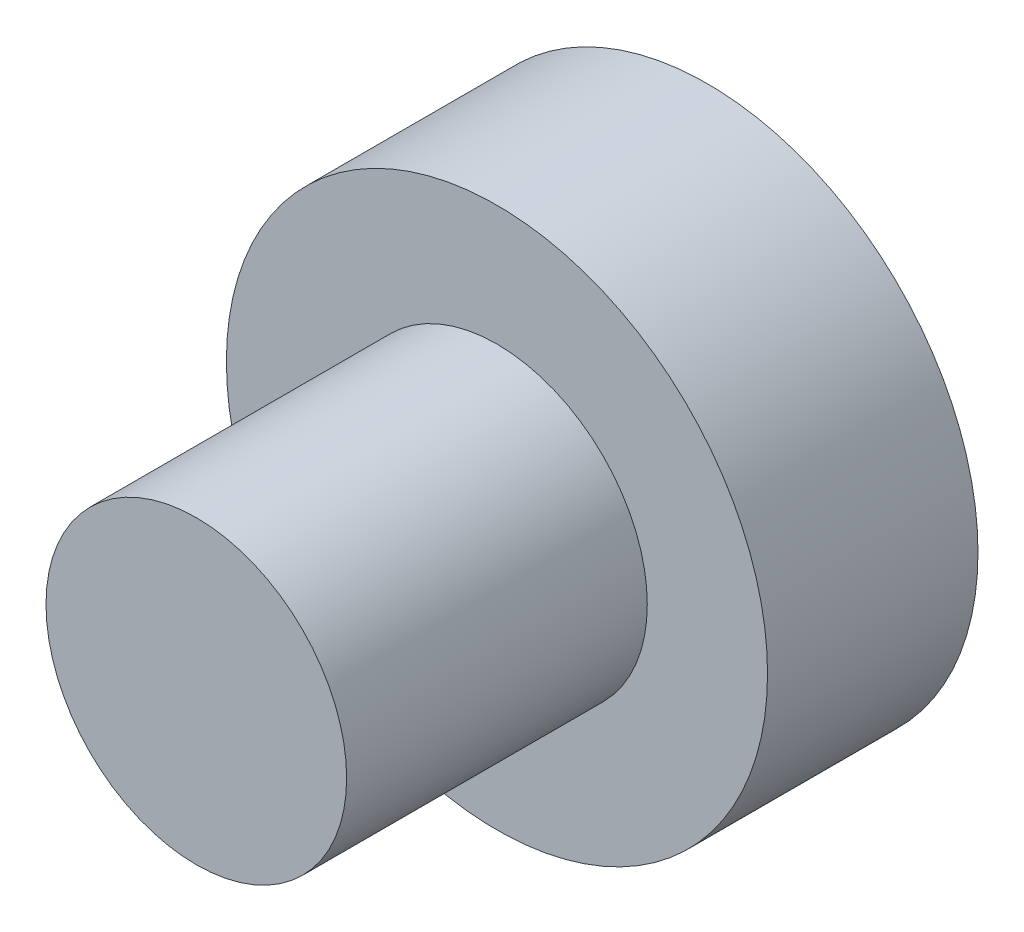
ISO-10303-21;
HEADER;
FILE_DESCRIPTION(('STEP AP214'),'2;1');
FILE_NAME('part.step','',(''),(''),'','','');
FILE_SCHEMA(('AUTOMOTIVE_DESIGN { 1 0 10303 214 1 1 1 1 }'));
ENDSEC;
DATA;
#1=APPLICATION_CONTEXT('core data for automotive mechanical design processes');
#2=APPLICATION_PROTOCOL_DEFINITION('international standard','automotive_design',2000,#1);
#3=PRODUCT_CONTEXT('',#1,'mechanical');
#4=PRODUCT('Part','Part','',(#3));
#5=PRODUCT_RELATED_PRODUCT_CATEGORY('part','',(#4));
#6=PRODUCT_DEFINITION_FORMATION('','',#4);
#7=PRODUCT_DEFINITION_CONTEXT('part definition',#1,'design');
#8=PRODUCT_DEFINITION('design','',#6,#7);
#9=PRODUCT_DEFINITION_SHAPE('','',#8);
#10=(LENGTH_UNIT() NAMED_UNIT(*) SI_UNIT(.MILLI.,.METRE.));
#11=(NAMED_UNIT(*) PLANE_ANGLE_UNIT() SI_UNIT($,.RADIAN.));
#12=(NAMED_UNIT(*) SI_UNIT($,.STERADIAN.) SOLID_ANGLE_UNIT());
#13=UNCERTAINTY_MEASURE_WITH_UNIT(LENGTH_MEASURE(1.E-05),#10,'distance_accuracy_value','');
#14=(GEOMETRIC_REPRESENTATION_CONTEXT(3) GLOBAL_UNCERTAINTY_ASSIGNED_CONTEXT((#13)) GLOBAL_UNIT_ASSIGNED_CONTEXT((#10,
#11,#12)) REPRESENTATION_CONTEXT('',''));
#15=CARTESIAN_POINT('',(0.,0.,0.));
#16=DIRECTION('',(0.,0.,1.));
#17=DIRECTION('',(1.,0.,0.));
#18=AXIS2_PLACEMENT_3D('',#15,#16,#17);
#19=CARTESIAN_POINT('',(0.,0.,10.));
#20=DIRECTION('',(0.,0.,-1.));
#21=DIRECTION('',(-1.,0.,0.));
#22=AXIS2_PLACEMENT_3D('',#19,#20,#21);
#23=CYLINDRICAL_SURFACE('',#22,5.);
#24=CARTESIAN_POINT('',(0.,0.,10.));
#25=DIRECTION('',(0.,0.,1.));
#26=DIRECTION('',(1.,0.,0.));
#27=AXIS2_PLACEMENT_3D('',#24,#25,#26);
#28=CIRCLE('',#27,5.);
#29=CARTESIAN_POINT('',(5.,0.,10.));
#30=VERTEX_POINT('',#29);
#31=EDGE_CURVE('E10',#30,#30,#28,.T.);
#32=ORIENTED_EDGE('',*,*,#31,.F.);
#33=EDGE_LOOP('',(#32));
#34=FACE_BOUND('',#33,.T.);
#35=CARTESIAN_POINT('',(0.,0.,0.));
#36=DIRECTION('',(0.,0.,1.));
#37=DIRECTION('',(1.,0.,0.));
#38=AXIS2_PLACEMENT_3D('',#35,#36,#37);
#39=CIRCLE('',#38,5.);
#40=CARTESIAN_POINT('',(5.,0.,0.));
#41=VERTEX_POINT('',#40);
#42=EDGE_CURVE('E34',#41,#41,#39,.T.);
#43=ORIENTED_EDGE('',*,*,#42,.T.);
#44=EDGE_LOOP('',(#43));
#45=FACE_BOUND('',#44,.T.);
#46=ADVANCED_FACE('F31',(#34,#45),#23,.T.);
#47=CARTESIAN_POINT('',(0.,0.,10.));
#48=DIRECTION('',(0.,0.,1.));
#49=DIRECTION('',(1.,0.,0.));
#50=AXIS2_PLACEMENT_3D('',#47,#48,#49);
#51=PLANE('',#50);
#52=ORIENTED_EDGE('',*,*,#31,.T.);
#53=EDGE_LOOP('',(#52));
#54=FACE_BOUND('',#53,.T.);
#55=ADVANCED_FACE('F73',(#54),#51,.T.);
#56=CARTESIAN_POINT('',(0.,0.,-7.));
#57=DIRECTION('',(0.,0.,1.));
#58=DIRECTION('',(1.,0.,0.));
#59=AXIS2_PLACEMENT_3D('',#56,#57,#58);
#60=CYLINDRICAL_SURFACE('',#59,9.);
#61=CARTESIAN_POINT('',(0.,0.,-7.));
#62=DIRECTION('',(0.,0.,-1.));
#63=DIRECTION('',(-1.,0.,0.));
#64=AXIS2_PLACEMENT_3D('',#61,#62,#63);
#65=CIRCLE('',#64,9.);
#66=CARTESIAN_POINT('',(-9.,0.,-7.));
#67=VERTEX_POINT('',#66);
#68=EDGE_CURVE('E41',#67,#67,#65,.T.);
#69=ORIENTED_EDGE('',*,*,#68,.F.);
#70=EDGE_LOOP('',(#69));
#71=FACE_BOUND('',#70,.T.);
#72=CARTESIAN_POINT('',(0.,0.,0.));
#73=DIRECTION('',(0.,0.,-1.));
#74=DIRECTION('',(-1.,0.,0.));
#75=AXIS2_PLACEMENT_3D('',#72,#73,#74);
#76=CIRCLE('',#75,9.);
#77=CARTESIAN_POINT('',(-9.,0.,0.));
#78=VERTEX_POINT('',#77);
#79=EDGE_CURVE('E43',#78,#78,#76,.T.);
#80=ORIENTED_EDGE('',*,*,#79,.T.);
#81=EDGE_LOOP('',(#80));
#82=FACE_BOUND('',#81,.T.);
#83=ADVANCED_FACE('F67',(#71,#82),#60,.T.);
#84=CARTESIAN_POINT('',(0.,0.,-7.));
#85=DIRECTION('',(0.,0.,-1.));
#86=DIRECTION('',(-1.,0.,0.));
#87=AXIS2_PLACEMENT_3D('',#84,#85,#86);
#88=PLANE('',#87);
#89=CARTESIAN_POINT('',(0.,0.,-7.));
#90=DIRECTION('',(0.,0.,-1.));
#91=DIRECTION('',(-1.,0.,0.));
#92=AXIS2_PLACEMENT_3D('',#89,#90,#91);
#93=CIRCLE('',#92,5.1);
#94=CARTESIAN_POINT('',(-5.1,0.,-7.));
#95=VERTEX_POINT('',#94);
#96=EDGE_CURVE('E49',#95,#95,#93,.T.);
#97=ORIENTED_EDGE('',*,*,#96,.F.);
#98=EDGE_LOOP('',(#97));
#99=FACE_BOUND('',#98,.T.);
#100=ORIENTED_EDGE('',*,*,#68,.T.);
#101=EDGE_LOOP('',(#100));
#102=FACE_BOUND('',#101,.T.);
#103=ADVANCED_FACE('F64',(#99,#102),#88,.T.);
#104=CARTESIAN_POINT('',(0.,0.,0.));
#105=DIRECTION('',(0.,0.,-1.));
#106=DIRECTION('',(-1.,0.,0.));
#107=AXIS2_PLACEMENT_3D('',#104,#105,#106);
#108=PLANE('',#107);
#109=ORIENTED_EDGE('',*,*,#42,.F.);
#110=EDGE_LOOP('',(#109));
#111=FACE_BOUND('',#110,.T.);
#112=ORIENTED_EDGE('',*,*,#79,.F.);
#113=EDGE_LOOP('',(#112));
#114=FACE_BOUND('',#113,.T.);
#115=ADVANCED_FACE('F60',(#111,#114),#108,.F.);
#116=CARTESIAN_POINT('',(0.,0.,-1.));
#117=DIRECTION('',(0.,0.,-1.));
#118=DIRECTION('',(-1.,0.,0.));
#119=AXIS2_PLACEMENT_3D('',#116,#117,#118);
#120=CYLINDRICAL_SURFACE('',#119,5.1);
#121=CARTESIAN_POINT('',(0.,0.,-1.));
#122=DIRECTION('',(0.,0.,-1.));
#123=DIRECTION('',(-1.,0.,0.));
#124=AXIS2_PLACEMENT_3D('',#121,#122,#123);
#125=CIRCLE('',#124,5.1);
#126=CARTESIAN_POINT('',(-5.1,0.,-1.));
#127=VERTEX_POINT('',#126);
#128=EDGE_CURVE('E46',#127,#127,#125,.T.);
#129=ORIENTED_EDGE('',*,*,#128,.F.);
#130=EDGE_LOOP('',(#129));
#131=FACE_BOUND('',#130,.T.);
#132=ORIENTED_EDGE('',*,*,#96,.T.);
#133=EDGE_LOOP('',(#132));
#134=FACE_BOUND('',#133,.T.);
#135=ADVANCED_FACE('F57',(#131,#134),#120,.F.);
#136=CARTESIAN_POINT('',(0.,0.,-1.));
#137=DIRECTION('',(0.,0.,-1.));
#138=DIRECTION('',(-1.,0.,0.));
#139=AXIS2_PLACEMENT_3D('',#136,#137,#138);
#140=PLANE('',#139);
#141=ORIENTED_EDGE('',*,*,#128,.T.);
#142=EDGE_LOOP('',(#141));
#143=FACE_BOUND('',#142,.T.);
#144=ADVANCED_FACE('F55',(#143),#140,.T.);
#145=CLOSED_SHELL('',(#46,#55,#83,#103,#115,#135,#144));
#146=MANIFOLD_SOLID_BREP('B2',#145);
#147=ADVANCED_BREP_SHAPE_REPRESENTATION('',(#18,#146),#14);
#148=SHAPE_DEFINITION_REPRESENTATION(#9,#147);
ENDSEC;
END-ISO-10303-21;
